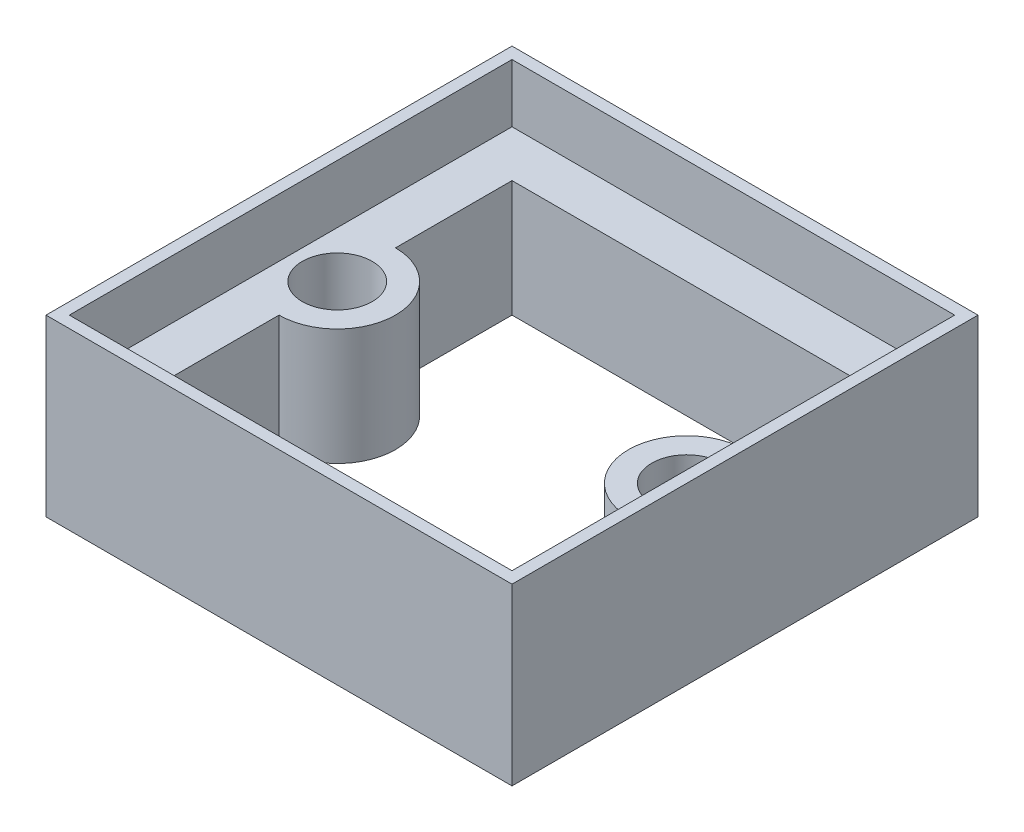
ISO-10303-21;
HEADER;
FILE_DESCRIPTION(('STEP AP214'),'2;1');
FILE_NAME('part.step','',(''),(''),'','','');
FILE_SCHEMA(('AUTOMOTIVE_DESIGN { 1 0 10303 214 1 1 1 1 }'));
ENDSEC;
DATA;
#1=APPLICATION_CONTEXT('core data for automotive mechanical design processes');
#2=APPLICATION_PROTOCOL_DEFINITION('international standard','automotive_design',2000,#1);
#3=PRODUCT_CONTEXT('',#1,'mechanical');
#4=PRODUCT('Part','Part','',(#3));
#5=PRODUCT_RELATED_PRODUCT_CATEGORY('part','',(#4));
#6=PRODUCT_DEFINITION_FORMATION('','',#4);
#7=PRODUCT_DEFINITION_CONTEXT('part definition',#1,'design');
#8=PRODUCT_DEFINITION('design','',#6,#7);
#9=PRODUCT_DEFINITION_SHAPE('','',#8);
#10=(LENGTH_UNIT() NAMED_UNIT(*) SI_UNIT(.MILLI.,.METRE.));
#11=(NAMED_UNIT(*) PLANE_ANGLE_UNIT() SI_UNIT($,.RADIAN.));
#12=(NAMED_UNIT(*) SI_UNIT($,.STERADIAN.) SOLID_ANGLE_UNIT());
#13=UNCERTAINTY_MEASURE_WITH_UNIT(LENGTH_MEASURE(1.E-05),#10,'distance_accuracy_value','');
#14=(GEOMETRIC_REPRESENTATION_CONTEXT(3) GLOBAL_UNCERTAINTY_ASSIGNED_CONTEXT((#13)) GLOBAL_UNIT_ASSIGNED_CONTEXT((#10,
#11,#12)) REPRESENTATION_CONTEXT('',''));
#15=CARTESIAN_POINT('',(0.,0.,0.));
#16=DIRECTION('',(0.,0.,1.));
#17=DIRECTION('',(1.,0.,0.));
#18=AXIS2_PLACEMENT_3D('',#15,#16,#17);
#19=CARTESIAN_POINT('',(-15.,10.,0.));
#20=DIRECTION('',(-1.,0.,0.));
#21=DIRECTION('',(0.,0.,1.));
#22=AXIS2_PLACEMENT_3D('',#19,#20,#21);
#23=PLANE('',#22);
#24=DIRECTION('',(0.,-1.,0.));
#25=VECTOR('',#24,1.);
#26=CARTESIAN_POINT('',(-15.,10.,5.));
#27=LINE('',#26,#25);
#28=CARTESIAN_POINT('',(-15.,10.,5.));
#29=VERTEX_POINT('',#28);
#30=CARTESIAN_POINT('',(-15.,0.,5.));
#31=VERTEX_POINT('',#30);
#32=EDGE_CURVE('E249',#29,#31,#27,.T.);
#33=ORIENTED_EDGE('',*,*,#32,.F.);
#34=DIRECTION('',(0.,0.,-1.));
#35=VECTOR('',#34,1.);
#36=CARTESIAN_POINT('',(-15.,10.,0.));
#37=LINE('',#36,#35);
#38=CARTESIAN_POINT('',(-15.,10.,15.));
#39=VERTEX_POINT('',#38);
#40=EDGE_CURVE('E263',#39,#29,#37,.T.);
#41=ORIENTED_EDGE('',*,*,#40,.F.);
#42=DIRECTION('',(0.,-1.,0.));
#43=VECTOR('',#42,1.);
#44=CARTESIAN_POINT('',(-15.,10.,15.));
#45=LINE('',#44,#43);
#46=CARTESIAN_POINT('',(-15.,0.,15.));
#47=VERTEX_POINT('',#46);
#48=EDGE_CURVE('E345',#39,#47,#45,.T.);
#49=ORIENTED_EDGE('',*,*,#48,.T.);
#50=DIRECTION('',(0.,0.,-1.));
#51=VECTOR('',#50,1.);
#52=CARTESIAN_POINT('',(-15.,0.,0.));
#53=LINE('',#52,#51);
#54=EDGE_CURVE('E307',#47,#31,#53,.T.);
#55=ORIENTED_EDGE('',*,*,#54,.T.);
#56=EDGE_LOOP('',(#33,#41,#49,#55));
#57=FACE_BOUND('',#56,.T.);
#58=ADVANCED_FACE('F44',(#57),#23,.F.);
#59=CARTESIAN_POINT('',(-15.,10.,0.));
#60=DIRECTION('',(-1.,0.,0.));
#61=DIRECTION('',(0.,0.,1.));
#62=AXIS2_PLACEMENT_3D('',#59,#60,#61);
#63=PLANE('',#62);
#64=DIRECTION('',(0.,-1.,0.));
#65=VECTOR('',#64,1.);
#66=CARTESIAN_POINT('',(-15.,10.,-4.99999999999999));
#67=LINE('',#66,#65);
#68=CARTESIAN_POINT('',(-15.,10.,-4.99999999999999));
#69=VERTEX_POINT('',#68);
#70=CARTESIAN_POINT('',(-15.,0.,-4.99999999999999));
#71=VERTEX_POINT('',#70);
#72=EDGE_CURVE('E242',#69,#71,#67,.T.);
#73=ORIENTED_EDGE('',*,*,#72,.T.);
#74=DIRECTION('',(0.,0.,-1.));
#75=VECTOR('',#74,1.);
#76=CARTESIAN_POINT('',(-15.,0.,0.));
#77=LINE('',#76,#75);
#78=CARTESIAN_POINT('',(-15.,0.,-15.));
#79=VERTEX_POINT('',#78);
#80=EDGE_CURVE('E310',#71,#79,#77,.T.);
#81=ORIENTED_EDGE('',*,*,#80,.T.);
#82=DIRECTION('',(0.,-1.,0.));
#83=VECTOR('',#82,1.);
#84=CARTESIAN_POINT('',(-15.,10.,-15.));
#85=LINE('',#84,#83);
#86=CARTESIAN_POINT('',(-15.,10.,-15.));
#87=VERTEX_POINT('',#86);
#88=EDGE_CURVE('E341',#87,#79,#85,.T.);
#89=ORIENTED_EDGE('',*,*,#88,.F.);
#90=DIRECTION('',(0.,0.,-1.));
#91=VECTOR('',#90,1.);
#92=CARTESIAN_POINT('',(-15.,10.,0.));
#93=LINE('',#92,#91);
#94=EDGE_CURVE('E271',#69,#87,#93,.T.);
#95=ORIENTED_EDGE('',*,*,#94,.F.);
#96=EDGE_LOOP('',(#73,#81,#89,#95));
#97=FACE_BOUND('',#96,.T.);
#98=ADVANCED_FACE('F397',(#97),#63,.F.);
#99=CARTESIAN_POINT('',(0.,10.,15.));
#100=DIRECTION('',(0.,0.,-1.));
#101=DIRECTION('',(-1.,0.,0.));
#102=AXIS2_PLACEMENT_3D('',#99,#100,#101);
#103=PLANE('',#102);
#104=DIRECTION('',(1.,0.,0.));
#105=VECTOR('',#104,1.);
#106=CARTESIAN_POINT('',(0.,0.,15.));
#107=LINE('',#106,#105);
#108=CARTESIAN_POINT('',(15.,0.,15.));
#109=VERTEX_POINT('',#108);
#110=EDGE_CURVE('E303',#47,#109,#107,.T.);
#111=ORIENTED_EDGE('',*,*,#110,.F.);
#112=ORIENTED_EDGE('',*,*,#48,.F.);
#113=DIRECTION('',(1.,0.,0.));
#114=VECTOR('',#113,1.);
#115=CARTESIAN_POINT('',(0.,10.,15.));
#116=LINE('',#115,#114);
#117=CARTESIAN_POINT('',(15.,10.,15.));
#118=VERTEX_POINT('',#117);
#119=EDGE_CURVE('E258',#39,#118,#116,.T.);
#120=ORIENTED_EDGE('',*,*,#119,.T.);
#121=DIRECTION('',(0.,-1.,0.));
#122=VECTOR('',#121,1.);
#123=CARTESIAN_POINT('',(15.,10.,15.));
#124=LINE('',#123,#122);
#125=EDGE_CURVE('E328',#118,#109,#124,.T.);
#126=ORIENTED_EDGE('',*,*,#125,.T.);
#127=EDGE_LOOP('',(#111,#112,#120,#126));
#128=FACE_BOUND('',#127,.T.);
#129=ADVANCED_FACE('F385',(#128),#103,.T.);
#130=CARTESIAN_POINT('',(-15.,10.,0.));
#131=DIRECTION('',(0.,-1.,0.));
#132=DIRECTION('',(0.,0.,-1.));
#133=AXIS2_PLACEMENT_3D('',#130,#131,#132);
#134=CYLINDRICAL_SURFACE('',#133,3.);
#135=CARTESIAN_POINT('',(-15.,2.,0.));
#136=DIRECTION('',(0.,1.,0.));
#137=DIRECTION('',(0.,0.,1.));
#138=AXIS2_PLACEMENT_3D('',#135,#136,#137);
#139=CIRCLE('',#138,3.);
#140=CARTESIAN_POINT('',(-15.,2.,3.00000000000001));
#141=VERTEX_POINT('',#140);
#142=EDGE_CURVE('E11',#141,#141,#139,.T.);
#143=ORIENTED_EDGE('',*,*,#142,.F.);
#144=EDGE_LOOP('',(#143));
#145=FACE_BOUND('',#144,.T.);
#146=CARTESIAN_POINT('',(-15.,10.,0.));
#147=DIRECTION('',(0.,1.,0.));
#148=DIRECTION('',(0.,0.,1.));
#149=AXIS2_PLACEMENT_3D('',#146,#147,#148);
#150=CIRCLE('',#149,3.);
#151=CARTESIAN_POINT('',(-15.,10.,3.00000000000001));
#152=VERTEX_POINT('',#151);
#153=EDGE_CURVE('E267',#152,#152,#150,.T.);
#154=ORIENTED_EDGE('',*,*,#153,.T.);
#155=EDGE_LOOP('',(#154));
#156=FACE_BOUND('',#155,.T.);
#157=ADVANCED_FACE('F431',(#145,#156),#134,.F.);
#158=CARTESIAN_POINT('',(0.,10.,-15.));
#159=DIRECTION('',(0.,0.,-1.));
#160=DIRECTION('',(-1.,0.,0.));
#161=AXIS2_PLACEMENT_3D('',#158,#159,#160);
#162=PLANE('',#161);
#163=DIRECTION('',(1.,0.,0.));
#164=VECTOR('',#163,1.);
#165=CARTESIAN_POINT('',(0.,0.,-15.));
#166=LINE('',#165,#164);
#167=CARTESIAN_POINT('',(15.,0.,-15.));
#168=VERTEX_POINT('',#167);
#169=EDGE_CURVE('E313',#79,#168,#166,.T.);
#170=ORIENTED_EDGE('',*,*,#169,.T.);
#171=DIRECTION('',(0.,-1.,0.));
#172=VECTOR('',#171,1.);
#173=CARTESIAN_POINT('',(15.,10.,-15.));
#174=LINE('',#173,#172);
#175=CARTESIAN_POINT('',(15.,10.,-15.));
#176=VERTEX_POINT('',#175);
#177=EDGE_CURVE('E338',#176,#168,#174,.T.);
#178=ORIENTED_EDGE('',*,*,#177,.F.);
#179=DIRECTION('',(1.,0.,0.));
#180=VECTOR('',#179,1.);
#181=CARTESIAN_POINT('',(0.,10.,-15.));
#182=LINE('',#181,#180);
#183=EDGE_CURVE('E274',#87,#176,#182,.T.);
#184=ORIENTED_EDGE('',*,*,#183,.F.);
#185=ORIENTED_EDGE('',*,*,#88,.T.);
#186=EDGE_LOOP('',(#170,#178,#184,#185));
#187=FACE_BOUND('',#186,.T.);
#188=ADVANCED_FACE('F402',(#187),#162,.F.);
#189=CARTESIAN_POINT('',(15.,10.,0.));
#190=DIRECTION('',(-1.,0.,0.));
#191=DIRECTION('',(0.,0.,1.));
#192=AXIS2_PLACEMENT_3D('',#189,#190,#191);
#193=PLANE('',#192);
#194=DIRECTION('',(0.,0.,-1.));
#195=VECTOR('',#194,1.);
#196=CARTESIAN_POINT('',(15.,0.,0.));
#197=LINE('',#196,#195);
#198=CARTESIAN_POINT('',(15.,0.,-5.));
#199=VERTEX_POINT('',#198);
#200=EDGE_CURVE('E317',#199,#168,#197,.T.);
#201=ORIENTED_EDGE('',*,*,#200,.F.);
#202=DIRECTION('',(0.,-1.,0.));
#203=VECTOR('',#202,1.);
#204=CARTESIAN_POINT('',(15.,10.,-5.));
#205=LINE('',#204,#203);
#206=CARTESIAN_POINT('',(15.,10.,-5.));
#207=VERTEX_POINT('',#206);
#208=EDGE_CURVE('E335',#207,#199,#205,.T.);
#209=ORIENTED_EDGE('',*,*,#208,.F.);
#210=DIRECTION('',(0.,0.,-1.));
#211=VECTOR('',#210,1.);
#212=CARTESIAN_POINT('',(15.,10.,0.));
#213=LINE('',#212,#211);
#214=EDGE_CURVE('E277',#207,#176,#213,.T.);
#215=ORIENTED_EDGE('',*,*,#214,.T.);
#216=ORIENTED_EDGE('',*,*,#177,.T.);
#217=EDGE_LOOP('',(#201,#209,#215,#216));
#218=FACE_BOUND('',#217,.T.);
#219=ADVANCED_FACE('F405',(#218),#193,.T.);
#220=CARTESIAN_POINT('',(15.,10.,0.));
#221=DIRECTION('',(0.,-1.,0.));
#222=DIRECTION('',(0.,0.,-1.));
#223=AXIS2_PLACEMENT_3D('',#220,#221,#222);
#224=CYLINDRICAL_SURFACE('',#223,5.);
#225=CARTESIAN_POINT('',(15.,0.,0.));
#226=DIRECTION('',(0.,1.,0.));
#227=DIRECTION('',(0.,0.,1.));
#228=AXIS2_PLACEMENT_3D('',#225,#226,#227);
#229=CIRCLE('',#228,5.);
#230=CARTESIAN_POINT('',(15.,0.,5.));
#231=VERTEX_POINT('',#230);
#232=EDGE_CURVE('E321',#199,#231,#229,.T.);
#233=ORIENTED_EDGE('',*,*,#232,.T.);
#234=DIRECTION('',(0.,-1.,0.));
#235=VECTOR('',#234,1.);
#236=CARTESIAN_POINT('',(15.,10.,5.));
#237=LINE('',#236,#235);
#238=CARTESIAN_POINT('',(15.,10.,5.));
#239=VERTEX_POINT('',#238);
#240=EDGE_CURVE('E331',#239,#231,#237,.T.);
#241=ORIENTED_EDGE('',*,*,#240,.F.);
#242=CARTESIAN_POINT('',(15.,10.,0.));
#243=DIRECTION('',(0.,1.,0.));
#244=DIRECTION('',(0.,0.,1.));
#245=AXIS2_PLACEMENT_3D('',#242,#243,#244);
#246=CIRCLE('',#245,5.);
#247=EDGE_CURVE('E281',#207,#239,#246,.T.);
#248=ORIENTED_EDGE('',*,*,#247,.F.);
#249=ORIENTED_EDGE('',*,*,#208,.T.);
#250=EDGE_LOOP('',(#233,#241,#248,#249));
#251=FACE_BOUND('',#250,.T.);
#252=ADVANCED_FACE('F409',(#251),#224,.T.);
#253=CARTESIAN_POINT('',(0.,10.,-20.));
#254=DIRECTION('',(0.,0.,-1.));
#255=DIRECTION('',(-1.,0.,0.));
#256=AXIS2_PLACEMENT_3D('',#253,#254,#255);
#257=PLANE('',#256);
#258=DIRECTION('',(1.,0.,0.));
#259=VECTOR('',#258,1.);
#260=CARTESIAN_POINT('',(0.,0.,-20.));
#261=LINE('',#260,#259);
#262=CARTESIAN_POINT('',(-20.,0.,-20.));
#263=VERTEX_POINT('',#262);
#264=CARTESIAN_POINT('',(20.,0.,-20.));
#265=VERTEX_POINT('',#264);
#266=EDGE_CURVE('E253',#263,#265,#261,.T.);
#267=ORIENTED_EDGE('',*,*,#266,.F.);
#268=DIRECTION('',(0.,-1.,0.));
#269=VECTOR('',#268,1.);
#270=CARTESIAN_POINT('',(-20.,10.,-20.));
#271=LINE('',#270,#269);
#272=CARTESIAN_POINT('',(-20.,15.,-20.));
#273=VERTEX_POINT('',#272);
#274=EDGE_CURVE('E332',#273,#263,#271,.T.);
#275=ORIENTED_EDGE('',*,*,#274,.F.);
#276=DIRECTION('',(-1.,0.,0.));
#277=VECTOR('',#276,1.);
#278=CARTESIAN_POINT('',(-20.,15.,-20.));
#279=LINE('',#278,#277);
#280=CARTESIAN_POINT('',(20.,15.,-20.));
#281=VERTEX_POINT('',#280);
#282=EDGE_CURVE('E209',#281,#273,#279,.T.);
#283=ORIENTED_EDGE('',*,*,#282,.F.);
#284=DIRECTION('',(0.,-1.,0.));
#285=VECTOR('',#284,1.);
#286=CARTESIAN_POINT('',(20.,10.,-20.));
#287=LINE('',#286,#285);
#288=EDGE_CURVE('E288',#281,#265,#287,.T.);
#289=ORIENTED_EDGE('',*,*,#288,.T.);
#290=EDGE_LOOP('',(#267,#275,#283,#289));
#291=FACE_BOUND('',#290,.T.);
#292=ADVANCED_FACE('F46',(#291),#257,.T.);
#293=CARTESIAN_POINT('',(-20.,10.,0.));
#294=DIRECTION('',(-1.,0.,0.));
#295=DIRECTION('',(0.,0.,1.));
#296=AXIS2_PLACEMENT_3D('',#293,#294,#295);
#297=PLANE('',#296);
#298=DIRECTION('',(0.,0.,-1.));
#299=VECTOR('',#298,1.);
#300=CARTESIAN_POINT('',(-20.,0.,0.));
#301=LINE('',#300,#299);
#302=CARTESIAN_POINT('',(-20.,0.,20.));
#303=VERTEX_POINT('',#302);
#304=EDGE_CURVE('E292',#303,#263,#301,.T.);
#305=ORIENTED_EDGE('',*,*,#304,.F.);
#306=DIRECTION('',(0.,-1.,0.));
#307=VECTOR('',#306,1.);
#308=CARTESIAN_POINT('',(-20.,10.,20.));
#309=LINE('',#308,#307);
#310=CARTESIAN_POINT('',(-20.,15.,20.));
#311=VERTEX_POINT('',#310);
#312=EDGE_CURVE('E354',#311,#303,#309,.T.);
#313=ORIENTED_EDGE('',*,*,#312,.F.);
#314=DIRECTION('',(0.,0.,1.));
#315=VECTOR('',#314,1.);
#316=CARTESIAN_POINT('',(-20.,15.,20.));
#317=LINE('',#316,#315);
#318=EDGE_CURVE('E213',#273,#311,#317,.T.);
#319=ORIENTED_EDGE('',*,*,#318,.F.);
#320=ORIENTED_EDGE('',*,*,#274,.T.);
#321=EDGE_LOOP('',(#305,#313,#319,#320));
#322=FACE_BOUND('',#321,.T.);
#323=ADVANCED_FACE('F435',(#322),#297,.T.);
#324=CARTESIAN_POINT('',(0.,10.,20.));
#325=DIRECTION('',(0.,0.,-1.));
#326=DIRECTION('',(-1.,0.,0.));
#327=AXIS2_PLACEMENT_3D('',#324,#325,#326);
#328=PLANE('',#327);
#329=DIRECTION('',(1.,0.,0.));
#330=VECTOR('',#329,1.);
#331=CARTESIAN_POINT('',(0.,0.,20.));
#332=LINE('',#331,#330);
#333=CARTESIAN_POINT('',(20.,0.,20.));
#334=VERTEX_POINT('',#333);
#335=EDGE_CURVE('E296',#303,#334,#332,.T.);
#336=ORIENTED_EDGE('',*,*,#335,.T.);
#337=DIRECTION('',(0.,-1.,0.));
#338=VECTOR('',#337,1.);
#339=CARTESIAN_POINT('',(20.,10.,20.));
#340=LINE('',#339,#338);
#341=CARTESIAN_POINT('',(20.,15.,20.));
#342=VERTEX_POINT('',#341);
#343=EDGE_CURVE('E350',#342,#334,#340,.T.);
#344=ORIENTED_EDGE('',*,*,#343,.F.);
#345=DIRECTION('',(1.,0.,0.));
#346=VECTOR('',#345,1.);
#347=CARTESIAN_POINT('',(-20.,15.,20.));
#348=LINE('',#347,#346);
#349=EDGE_CURVE('E217',#311,#342,#348,.T.);
#350=ORIENTED_EDGE('',*,*,#349,.F.);
#351=ORIENTED_EDGE('',*,*,#312,.T.);
#352=EDGE_LOOP('',(#336,#344,#350,#351));
#353=FACE_BOUND('',#352,.T.);
#354=ADVANCED_FACE('F369',(#353),#328,.F.);
#355=CARTESIAN_POINT('',(15.,10.,0.));
#356=DIRECTION('',(0.,-1.,0.));
#357=DIRECTION('',(0.,0.,-1.));
#358=AXIS2_PLACEMENT_3D('',#355,#356,#357);
#359=CYLINDRICAL_SURFACE('',#358,3.);
#360=CARTESIAN_POINT('',(15.,2.,0.));
#361=DIRECTION('',(0.,1.,0.));
#362=DIRECTION('',(0.,0.,1.));
#363=AXIS2_PLACEMENT_3D('',#360,#361,#362);
#364=CIRCLE('',#363,3.);
#365=CARTESIAN_POINT('',(15.,2.,3.));
#366=VERTEX_POINT('',#365);
#367=EDGE_CURVE('E53',#366,#366,#364,.T.);
#368=ORIENTED_EDGE('',*,*,#367,.F.);
#369=EDGE_LOOP('',(#368));
#370=FACE_BOUND('',#369,.T.);
#371=CARTESIAN_POINT('',(15.,10.,0.));
#372=DIRECTION('',(0.,1.,0.));
#373=DIRECTION('',(0.,0.,1.));
#374=AXIS2_PLACEMENT_3D('',#371,#372,#373);
#375=CIRCLE('',#374,3.);
#376=CARTESIAN_POINT('',(15.,10.,3.));
#377=VERTEX_POINT('',#376);
#378=EDGE_CURVE('E254',#377,#377,#375,.T.);
#379=ORIENTED_EDGE('',*,*,#378,.T.);
#380=EDGE_LOOP('',(#379));
#381=FACE_BOUND('',#380,.T.);
#382=ADVANCED_FACE('F365',(#370,#381),#359,.F.);
#383=CARTESIAN_POINT('',(20.,10.,0.));
#384=DIRECTION('',(-1.,0.,0.));
#385=DIRECTION('',(0.,0.,1.));
#386=AXIS2_PLACEMENT_3D('',#383,#384,#385);
#387=PLANE('',#386);
#388=DIRECTION('',(0.,0.,-1.));
#389=VECTOR('',#388,1.);
#390=CARTESIAN_POINT('',(20.,0.,0.));
#391=LINE('',#390,#389);
#392=EDGE_CURVE('E299',#334,#265,#391,.T.);
#393=ORIENTED_EDGE('',*,*,#392,.T.);
#394=ORIENTED_EDGE('',*,*,#288,.F.);
#395=DIRECTION('',(0.,0.,-1.));
#396=VECTOR('',#395,1.);
#397=CARTESIAN_POINT('',(20.,15.,20.));
#398=LINE('',#397,#396);
#399=EDGE_CURVE('E174',#342,#281,#398,.T.);
#400=ORIENTED_EDGE('',*,*,#399,.F.);
#401=ORIENTED_EDGE('',*,*,#343,.T.);
#402=EDGE_LOOP('',(#393,#394,#400,#401));
#403=FACE_BOUND('',#402,.T.);
#404=ADVANCED_FACE('F368',(#403),#387,.F.);
#405=CARTESIAN_POINT('',(15.,10.,0.));
#406=DIRECTION('',(-1.,0.,0.));
#407=DIRECTION('',(0.,0.,1.));
#408=AXIS2_PLACEMENT_3D('',#405,#406,#407);
#409=PLANE('',#408);
#410=DIRECTION('',(0.,0.,-1.));
#411=VECTOR('',#410,1.);
#412=CARTESIAN_POINT('',(15.,0.,0.));
#413=LINE('',#412,#411);
#414=EDGE_CURVE('E259',#109,#231,#413,.T.);
#415=ORIENTED_EDGE('',*,*,#414,.F.);
#416=ORIENTED_EDGE('',*,*,#125,.F.);
#417=DIRECTION('',(0.,0.,-1.));
#418=VECTOR('',#417,1.);
#419=CARTESIAN_POINT('',(15.,10.,0.));
#420=LINE('',#419,#418);
#421=EDGE_CURVE('E284',#118,#239,#420,.T.);
#422=ORIENTED_EDGE('',*,*,#421,.T.);
#423=ORIENTED_EDGE('',*,*,#240,.T.);
#424=EDGE_LOOP('',(#415,#416,#422,#423));
#425=FACE_BOUND('',#424,.T.);
#426=ADVANCED_FACE('F377',(#425),#409,.T.);
#427=CARTESIAN_POINT('',(0.,10.,0.));
#428=DIRECTION('',(0.,1.,0.));
#429=DIRECTION('',(0.,0.,1.));
#430=AXIS2_PLACEMENT_3D('',#427,#428,#429);
#431=PLANE('',#430);
#432=DIRECTION('',(0.,0.,-1.));
#433=VECTOR('',#432,1.);
#434=CARTESIAN_POINT('',(19.,10.,19.));
#435=LINE('',#434,#433);
#436=CARTESIAN_POINT('',(19.,10.,19.));
#437=VERTEX_POINT('',#436);
#438=CARTESIAN_POINT('',(19.,10.,-19.));
#439=VERTEX_POINT('',#438);
#440=EDGE_CURVE('E60',#437,#439,#435,.T.);
#441=ORIENTED_EDGE('',*,*,#440,.T.);
#442=DIRECTION('',(-1.,0.,0.));
#443=VECTOR('',#442,1.);
#444=CARTESIAN_POINT('',(-19.,10.,-19.));
#445=LINE('',#444,#443);
#446=CARTESIAN_POINT('',(-19.,10.,-19.));
#447=VERTEX_POINT('',#446);
#448=EDGE_CURVE('E64',#439,#447,#445,.T.);
#449=ORIENTED_EDGE('',*,*,#448,.T.);
#450=DIRECTION('',(0.,0.,1.));
#451=VECTOR('',#450,1.);
#452=CARTESIAN_POINT('',(-19.,10.,19.));
#453=LINE('',#452,#451);
#454=CARTESIAN_POINT('',(-19.,10.,19.));
#455=VERTEX_POINT('',#454);
#456=EDGE_CURVE('E193',#447,#455,#453,.T.);
#457=ORIENTED_EDGE('',*,*,#456,.T.);
#458=DIRECTION('',(1.,0.,0.));
#459=VECTOR('',#458,1.);
#460=CARTESIAN_POINT('',(-19.,10.,19.));
#461=LINE('',#460,#459);
#462=EDGE_CURVE('E168',#455,#437,#461,.T.);
#463=ORIENTED_EDGE('',*,*,#462,.T.);
#464=EDGE_LOOP('',(#441,#449,#457,#463));
#465=FACE_BOUND('',#464,.T.);
#466=ORIENTED_EDGE('',*,*,#153,.F.);
#467=EDGE_LOOP('',(#466));
#468=FACE_BOUND('',#467,.T.);
#469=ORIENTED_EDGE('',*,*,#378,.F.);
#470=EDGE_LOOP('',(#469));
#471=FACE_BOUND('',#470,.T.);
#472=ORIENTED_EDGE('',*,*,#119,.F.);
#473=ORIENTED_EDGE('',*,*,#40,.T.);
#474=CARTESIAN_POINT('',(-15.,10.,0.));
#475=DIRECTION('',(0.,1.,0.));
#476=DIRECTION('',(0.,0.,1.));
#477=AXIS2_PLACEMENT_3D('',#474,#475,#476);
#478=CIRCLE('',#477,5.);
#479=EDGE_CURVE('E238',#29,#69,#478,.T.);
#480=ORIENTED_EDGE('',*,*,#479,.T.);
#481=ORIENTED_EDGE('',*,*,#94,.T.);
#482=ORIENTED_EDGE('',*,*,#183,.T.);
#483=ORIENTED_EDGE('',*,*,#214,.F.);
#484=ORIENTED_EDGE('',*,*,#247,.T.);
#485=ORIENTED_EDGE('',*,*,#421,.F.);
#486=EDGE_LOOP('',(#472,#473,#480,#481,#482,#483,#484,#485));
#487=FACE_BOUND('',#486,.T.);
#488=ADVANCED_FACE('F373',(#465,#468,#471,#487),#431,.T.);
#489=CARTESIAN_POINT('',(0.,0.,0.));
#490=DIRECTION('',(0.,1.,0.));
#491=DIRECTION('',(0.,0.,1.));
#492=AXIS2_PLACEMENT_3D('',#489,#490,#491);
#493=PLANE('',#492);
#494=ORIENTED_EDGE('',*,*,#266,.T.);
#495=ORIENTED_EDGE('',*,*,#392,.F.);
#496=ORIENTED_EDGE('',*,*,#335,.F.);
#497=ORIENTED_EDGE('',*,*,#304,.T.);
#498=EDGE_LOOP('',(#494,#495,#496,#497));
#499=FACE_BOUND('',#498,.T.);
#500=ORIENTED_EDGE('',*,*,#110,.T.);
#501=ORIENTED_EDGE('',*,*,#414,.T.);
#502=ORIENTED_EDGE('',*,*,#232,.F.);
#503=ORIENTED_EDGE('',*,*,#200,.T.);
#504=ORIENTED_EDGE('',*,*,#169,.F.);
#505=ORIENTED_EDGE('',*,*,#80,.F.);
#506=CARTESIAN_POINT('',(-15.,0.,0.));
#507=DIRECTION('',(0.,1.,0.));
#508=DIRECTION('',(0.,0.,1.));
#509=AXIS2_PLACEMENT_3D('',#506,#507,#508);
#510=CIRCLE('',#509,5.);
#511=EDGE_CURVE('E226',#31,#71,#510,.T.);
#512=ORIENTED_EDGE('',*,*,#511,.F.);
#513=ORIENTED_EDGE('',*,*,#54,.F.);
#514=EDGE_LOOP('',(#500,#501,#502,#503,#504,#505,#512,#513));
#515=FACE_BOUND('',#514,.T.);
#516=CARTESIAN_POINT('',(15.,0.,0.));
#517=DIRECTION('',(0.,1.,0.));
#518=DIRECTION('',(0.,0.,1.));
#519=AXIS2_PLACEMENT_3D('',#516,#517,#518);
#520=CIRCLE('',#519,1.5);
#521=CARTESIAN_POINT('',(15.,0.,1.5));
#522=VERTEX_POINT('',#521);
#523=EDGE_CURVE('E221',#522,#522,#520,.T.);
#524=ORIENTED_EDGE('',*,*,#523,.T.);
#525=EDGE_LOOP('',(#524));
#526=FACE_BOUND('',#525,.T.);
#527=CARTESIAN_POINT('',(-15.,0.,0.));
#528=DIRECTION('',(0.,1.,0.));
#529=DIRECTION('',(0.,0.,1.));
#530=AXIS2_PLACEMENT_3D('',#527,#528,#529);
#531=CIRCLE('',#530,1.5);
#532=CARTESIAN_POINT('',(-15.,0.,1.5));
#533=VERTEX_POINT('',#532);
#534=EDGE_CURVE('E227',#533,#533,#531,.F.);
#535=ORIENTED_EDGE('',*,*,#534,.F.);
#536=EDGE_LOOP('',(#535));
#537=FACE_BOUND('',#536,.T.);
#538=ADVANCED_FACE('F376',(#499,#515,#526,#537),#493,.F.);
#539=CARTESIAN_POINT('',(-15.,10.,0.));
#540=DIRECTION('',(0.,-1.,0.));
#541=DIRECTION('',(0.,0.,-1.));
#542=AXIS2_PLACEMENT_3D('',#539,#540,#541);
#543=CYLINDRICAL_SURFACE('',#542,5.);
#544=ORIENTED_EDGE('',*,*,#511,.T.);
#545=ORIENTED_EDGE('',*,*,#72,.F.);
#546=ORIENTED_EDGE('',*,*,#479,.F.);
#547=ORIENTED_EDGE('',*,*,#32,.T.);
#548=EDGE_LOOP('',(#544,#545,#546,#547));
#549=FACE_BOUND('',#548,.T.);
#550=ADVANCED_FACE('F390',(#549),#543,.T.);
#551=CARTESIAN_POINT('',(15.,2.,0.));
#552=DIRECTION('',(0.,-1.,0.));
#553=DIRECTION('',(0.,0.,-1.));
#554=AXIS2_PLACEMENT_3D('',#551,#552,#553);
#555=CYLINDRICAL_SURFACE('',#554,1.5);
#556=CARTESIAN_POINT('',(15.,2.,0.));
#557=DIRECTION('',(0.,1.,0.));
#558=DIRECTION('',(0.,0.,1.));
#559=AXIS2_PLACEMENT_3D('',#556,#557,#558);
#560=CIRCLE('',#559,1.5);
#561=CARTESIAN_POINT('',(15.,2.,1.5));
#562=VERTEX_POINT('',#561);
#563=EDGE_CURVE('E231',#562,#562,#560,.T.);
#564=ORIENTED_EDGE('',*,*,#563,.T.);
#565=EDGE_LOOP('',(#564));
#566=FACE_BOUND('',#565,.T.);
#567=ORIENTED_EDGE('',*,*,#523,.F.);
#568=EDGE_LOOP('',(#567));
#569=FACE_BOUND('',#568,.T.);
#570=ADVANCED_FACE('F471',(#566,#569),#555,.F.);
#571=CARTESIAN_POINT('',(0.,2.,0.));
#572=DIRECTION('',(0.,1.,0.));
#573=DIRECTION('',(0.,0.,1.));
#574=AXIS2_PLACEMENT_3D('',#571,#572,#573);
#575=PLANE('',#574);
#576=ORIENTED_EDGE('',*,*,#367,.T.);
#577=EDGE_LOOP('',(#576));
#578=FACE_BOUND('',#577,.T.);
#579=ORIENTED_EDGE('',*,*,#563,.F.);
#580=EDGE_LOOP('',(#579));
#581=FACE_BOUND('',#580,.T.);
#582=ADVANCED_FACE('F362',(#578,#581),#575,.T.);
#583=CARTESIAN_POINT('',(-15.,2.,0.));
#584=DIRECTION('',(0.,-1.,0.));
#585=DIRECTION('',(0.,0.,-1.));
#586=AXIS2_PLACEMENT_3D('',#583,#584,#585);
#587=CYLINDRICAL_SURFACE('',#586,1.5);
#588=CARTESIAN_POINT('',(-15.,2.,0.));
#589=DIRECTION('',(0.,1.,0.));
#590=DIRECTION('',(0.,0.,1.));
#591=AXIS2_PLACEMENT_3D('',#588,#589,#590);
#592=CIRCLE('',#591,1.5);
#593=CARTESIAN_POINT('',(-15.,2.,1.5));
#594=VERTEX_POINT('',#593);
#595=EDGE_CURVE('E222',#594,#594,#592,.F.);
#596=ORIENTED_EDGE('',*,*,#595,.F.);
#597=EDGE_LOOP('',(#596));
#598=FACE_BOUND('',#597,.T.);
#599=ORIENTED_EDGE('',*,*,#534,.T.);
#600=EDGE_LOOP('',(#599));
#601=FACE_BOUND('',#600,.T.);
#602=ADVANCED_FACE('F461',(#598,#601),#587,.F.);
#603=CARTESIAN_POINT('',(0.,2.,0.));
#604=DIRECTION('',(0.,1.,0.));
#605=DIRECTION('',(0.,0.,1.));
#606=AXIS2_PLACEMENT_3D('',#603,#604,#605);
#607=PLANE('',#606);
#608=ORIENTED_EDGE('',*,*,#142,.T.);
#609=EDGE_LOOP('',(#608));
#610=FACE_BOUND('',#609,.T.);
#611=ORIENTED_EDGE('',*,*,#595,.T.);
#612=EDGE_LOOP('',(#611));
#613=FACE_BOUND('',#612,.T.);
#614=ADVANCED_FACE('F454',(#610,#613),#607,.T.);
#615=CARTESIAN_POINT('',(0.,15.,0.));
#616=DIRECTION('',(0.,-1.,0.));
#617=DIRECTION('',(0.,0.,-1.));
#618=AXIS2_PLACEMENT_3D('',#615,#616,#617);
#619=PLANE('',#618);
#620=ORIENTED_EDGE('',*,*,#399,.T.);
#621=ORIENTED_EDGE('',*,*,#282,.T.);
#622=ORIENTED_EDGE('',*,*,#318,.T.);
#623=ORIENTED_EDGE('',*,*,#349,.T.);
#624=EDGE_LOOP('',(#620,#621,#622,#623));
#625=FACE_BOUND('',#624,.T.);
#626=DIRECTION('',(0.,0.,-1.));
#627=VECTOR('',#626,1.);
#628=CARTESIAN_POINT('',(19.,15.,19.));
#629=LINE('',#628,#627);
#630=CARTESIAN_POINT('',(19.,15.,19.));
#631=VERTEX_POINT('',#630);
#632=CARTESIAN_POINT('',(19.,15.,-19.));
#633=VERTEX_POINT('',#632);
#634=EDGE_CURVE('E157',#631,#633,#629,.T.);
#635=ORIENTED_EDGE('',*,*,#634,.F.);
#636=DIRECTION('',(1.,0.,0.));
#637=VECTOR('',#636,1.);
#638=CARTESIAN_POINT('',(-19.,15.,19.));
#639=LINE('',#638,#637);
#640=CARTESIAN_POINT('',(-19.,15.,19.));
#641=VERTEX_POINT('',#640);
#642=EDGE_CURVE('E184',#641,#631,#639,.T.);
#643=ORIENTED_EDGE('',*,*,#642,.F.);
#644=DIRECTION('',(0.,0.,1.));
#645=VECTOR('',#644,1.);
#646=CARTESIAN_POINT('',(-19.,15.,19.));
#647=LINE('',#646,#645);
#648=CARTESIAN_POINT('',(-19.,15.,-19.));
#649=VERTEX_POINT('',#648);
#650=EDGE_CURVE('E180',#649,#641,#647,.T.);
#651=ORIENTED_EDGE('',*,*,#650,.F.);
#652=DIRECTION('',(-1.,0.,0.));
#653=VECTOR('',#652,1.);
#654=CARTESIAN_POINT('',(-19.,15.,-19.));
#655=LINE('',#654,#653);
#656=EDGE_CURVE('E167',#633,#649,#655,.T.);
#657=ORIENTED_EDGE('',*,*,#656,.F.);
#658=EDGE_LOOP('',(#635,#643,#651,#657));
#659=FACE_BOUND('',#658,.T.);
#660=ADVANCED_FACE('F178',(#625,#659),#619,.F.);
#661=CARTESIAN_POINT('',(19.,15.,19.));
#662=DIRECTION('',(-1.,0.,0.));
#663=DIRECTION('',(0.,0.,1.));
#664=AXIS2_PLACEMENT_3D('',#661,#662,#663);
#665=PLANE('',#664);
#666=ORIENTED_EDGE('',*,*,#440,.F.);
#667=DIRECTION('',(0.,-1.,0.));
#668=VECTOR('',#667,1.);
#669=CARTESIAN_POINT('',(19.,15.,19.));
#670=LINE('',#669,#668);
#671=EDGE_CURVE('E162',#631,#437,#670,.T.);
#672=ORIENTED_EDGE('',*,*,#671,.F.);
#673=ORIENTED_EDGE('',*,*,#634,.T.);
#674=DIRECTION('',(0.,-1.,0.));
#675=VECTOR('',#674,1.);
#676=CARTESIAN_POINT('',(19.,15.,-19.));
#677=LINE('',#676,#675);
#678=EDGE_CURVE('E160',#633,#439,#677,.T.);
#679=ORIENTED_EDGE('',*,*,#678,.T.);
#680=EDGE_LOOP('',(#666,#672,#673,#679));
#681=FACE_BOUND('',#680,.T.);
#682=ADVANCED_FACE('F159',(#681),#665,.T.);
#683=CARTESIAN_POINT('',(-19.,15.,-19.));
#684=DIRECTION('',(0.,0.,1.));
#685=DIRECTION('',(1.,0.,0.));
#686=AXIS2_PLACEMENT_3D('',#683,#684,#685);
#687=PLANE('',#686);
#688=ORIENTED_EDGE('',*,*,#448,.F.);
#689=ORIENTED_EDGE('',*,*,#678,.F.);
#690=ORIENTED_EDGE('',*,*,#656,.T.);
#691=DIRECTION('',(0.,-1.,0.));
#692=VECTOR('',#691,1.);
#693=CARTESIAN_POINT('',(-19.,15.,-19.));
#694=LINE('',#693,#692);
#695=EDGE_CURVE('E175',#649,#447,#694,.T.);
#696=ORIENTED_EDGE('',*,*,#695,.T.);
#697=EDGE_LOOP('',(#688,#689,#690,#696));
#698=FACE_BOUND('',#697,.T.);
#699=ADVANCED_FACE('F171',(#698),#687,.T.);
#700=CARTESIAN_POINT('',(-19.,15.,19.));
#701=DIRECTION('',(1.,0.,0.));
#702=DIRECTION('',(0.,0.,-1.));
#703=AXIS2_PLACEMENT_3D('',#700,#701,#702);
#704=PLANE('',#703);
#705=ORIENTED_EDGE('',*,*,#456,.F.);
#706=ORIENTED_EDGE('',*,*,#695,.F.);
#707=ORIENTED_EDGE('',*,*,#650,.T.);
#708=DIRECTION('',(0.,-1.,0.));
#709=VECTOR('',#708,1.);
#710=CARTESIAN_POINT('',(-19.,15.,19.));
#711=LINE('',#710,#709);
#712=EDGE_CURVE('E200',#641,#455,#711,.T.);
#713=ORIENTED_EDGE('',*,*,#712,.T.);
#714=EDGE_LOOP('',(#705,#706,#707,#713));
#715=FACE_BOUND('',#714,.T.);
#716=ADVANCED_FACE('F553',(#715),#704,.T.);
#717=CARTESIAN_POINT('',(-19.,15.,19.));
#718=DIRECTION('',(0.,0.,-1.));
#719=DIRECTION('',(-1.,0.,0.));
#720=AXIS2_PLACEMENT_3D('',#717,#718,#719);
#721=PLANE('',#720);
#722=ORIENTED_EDGE('',*,*,#462,.F.);
#723=ORIENTED_EDGE('',*,*,#712,.F.);
#724=ORIENTED_EDGE('',*,*,#642,.T.);
#725=ORIENTED_EDGE('',*,*,#671,.T.);
#726=EDGE_LOOP('',(#722,#723,#724,#725));
#727=FACE_BOUND('',#726,.T.);
#728=ADVANCED_FACE('F561',(#727),#721,.T.);
#729=CLOSED_SHELL('',(#58,#98,#129,#157,#188,#219,#252,#292,#323,#354,#382,#404,#426,#488,#538,
#550,#570,#582,#602,#614,#660,#682,#699,#716,#728));
#730=MANIFOLD_SOLID_BREP('B2',#729);
#731=ADVANCED_BREP_SHAPE_REPRESENTATION('',(#18,#730),#14);
#732=SHAPE_DEFINITION_REPRESENTATION(#9,#731);
ENDSEC;
END-ISO-10303-21;
